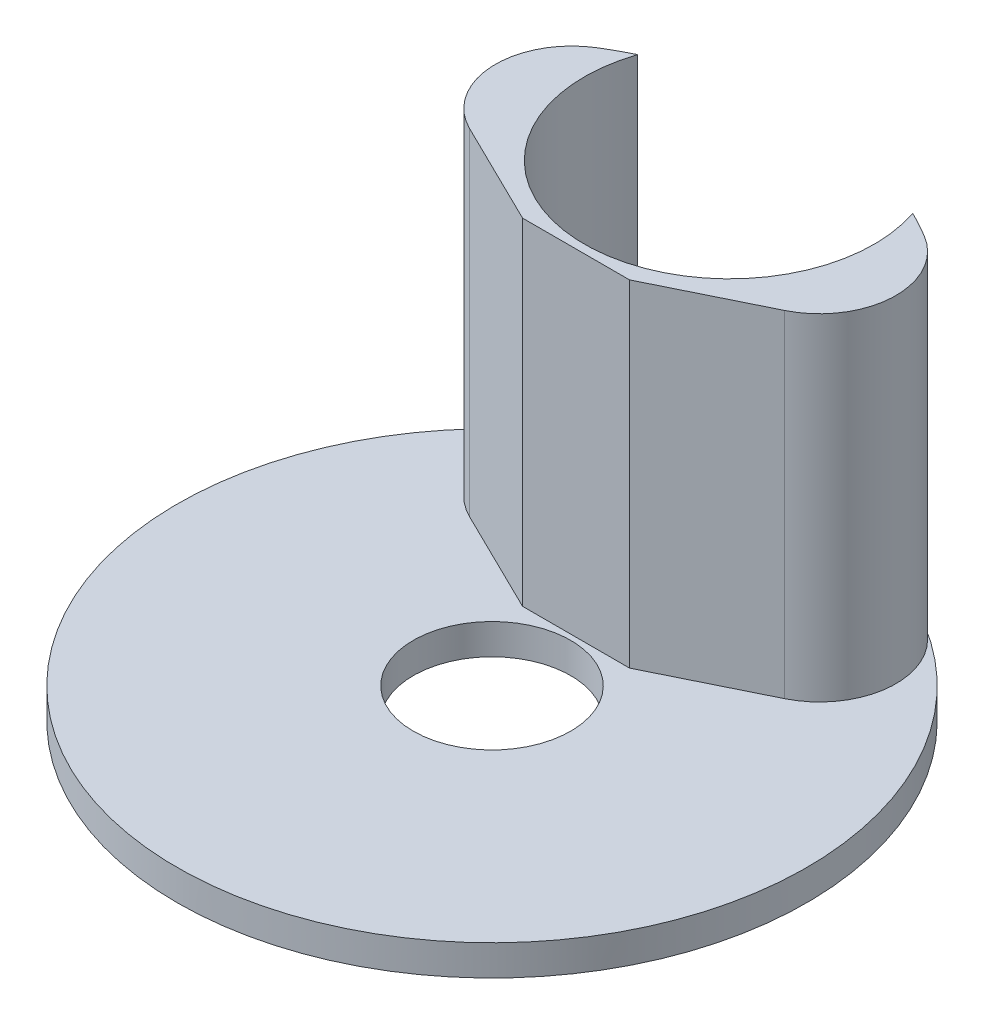
ISO-10303-21;
HEADER;
FILE_DESCRIPTION(('STEP AP214'),'2;1');
FILE_NAME('part.step','',(''),(''),'','','');
FILE_SCHEMA(('AUTOMOTIVE_DESIGN { 1 0 10303 214 1 1 1 1 }'));
ENDSEC;
DATA;
#1=APPLICATION_CONTEXT('core data for automotive mechanical design processes');
#2=APPLICATION_PROTOCOL_DEFINITION('international standard','automotive_design',2000,#1);
#3=PRODUCT_CONTEXT('',#1,'mechanical');
#4=PRODUCT('Part','Part','',(#3));
#5=PRODUCT_RELATED_PRODUCT_CATEGORY('part','',(#4));
#6=PRODUCT_DEFINITION_FORMATION('','',#4);
#7=PRODUCT_DEFINITION_CONTEXT('part definition',#1,'design');
#8=PRODUCT_DEFINITION('design','',#6,#7);
#9=PRODUCT_DEFINITION_SHAPE('','',#8);
#10=(LENGTH_UNIT() NAMED_UNIT(*) SI_UNIT(.MILLI.,.METRE.));
#11=(NAMED_UNIT(*) PLANE_ANGLE_UNIT() SI_UNIT($,.RADIAN.));
#12=(NAMED_UNIT(*) SI_UNIT($,.STERADIAN.) SOLID_ANGLE_UNIT());
#13=UNCERTAINTY_MEASURE_WITH_UNIT(LENGTH_MEASURE(1.E-05),#10,'distance_accuracy_value','');
#14=(GEOMETRIC_REPRESENTATION_CONTEXT(3) GLOBAL_UNCERTAINTY_ASSIGNED_CONTEXT((#13)) GLOBAL_UNIT_ASSIGNED_CONTEXT((#10,
#11,#12)) REPRESENTATION_CONTEXT('',''));
#15=CARTESIAN_POINT('',(0.,0.,0.));
#16=DIRECTION('',(0.,0.,1.));
#17=DIRECTION('',(1.,0.,0.));
#18=AXIS2_PLACEMENT_3D('',#15,#16,#17);
#19=CARTESIAN_POINT('',(0.,2.,0.));
#20=DIRECTION('',(0.,1.,0.));
#21=DIRECTION('',(0.,0.,1.));
#22=AXIS2_PLACEMENT_3D('',#19,#20,#21);
#23=PLANE('',#22);
#24=CARTESIAN_POINT('',(0.,2.,-13.));
#25=DIRECTION('',(0.,1.,0.));
#26=DIRECTION('',(0.,0.,1.));
#27=AXIS2_PLACEMENT_3D('',#24,#25,#26);
#28=CIRCLE('',#27,6.5);
#29=CARTESIAN_POINT('',(0.,2.,-6.5));
#30=VERTEX_POINT('',#29);
#31=EDGE_CURVE('E120',#30,#30,#28,.T.);
#32=ORIENTED_EDGE('',*,*,#31,.F.);
#33=EDGE_LOOP('',(#32));
#34=FACE_BOUND('',#33,.T.);
#35=CARTESIAN_POINT('',(0.,2.,0.));
#36=DIRECTION('',(0.,1.,0.));
#37=DIRECTION('',(0.,0.,1.));
#38=AXIS2_PLACEMENT_3D('',#35,#36,#37);
#39=CIRCLE('',#38,20.6);
#40=CARTESIAN_POINT('',(9.,2.,-18.5299757150408));
#41=VERTEX_POINT('',#40);
#42=CARTESIAN_POINT('',(-9.00000000000001,2.,-18.5299757150408));
#43=VERTEX_POINT('',#42);
#44=EDGE_CURVE('E183',#41,#43,#39,.T.);
#45=ORIENTED_EDGE('',*,*,#44,.T.);
#46=CARTESIAN_POINT('',(0.,2.,-15.5296842366197));
#47=DIRECTION('',(0.,1.,0.));
#48=DIRECTION('',(0.,0.,1.));
#49=AXIS2_PLACEMENT_3D('',#46,#47,#48);
#50=CIRCLE('',#49,9.48692515810502);
#51=EDGE_CURVE('E115',#43,#41,#50,.T.);
#52=ORIENTED_EDGE('',*,*,#51,.T.);
#53=EDGE_LOOP('',(#45,#52));
#54=FACE_BOUND('',#53,.T.);
#55=ADVANCED_FACE('F41',(#34,#54),#23,.T.);
#56=CARTESIAN_POINT('',(0.,2.,0.));
#57=DIRECTION('',(0.,-1.,0.));
#58=DIRECTION('',(0.,0.,-1.));
#59=AXIS2_PLACEMENT_3D('',#56,#57,#58);
#60=CYLINDRICAL_SURFACE('',#59,20.6);
#61=CARTESIAN_POINT('',(0.,24.,0.));
#62=DIRECTION('',(0.,1.,0.));
#63=DIRECTION('',(0.,0.,1.));
#64=AXIS2_PLACEMENT_3D('',#61,#62,#63);
#65=CIRCLE('',#64,20.6);
#66=CARTESIAN_POINT('',(10.7020794980103,24.,-17.6018605385416));
#67=VERTEX_POINT('',#66);
#68=CARTESIAN_POINT('',(9.,24.,-18.5299757150408));
#69=VERTEX_POINT('',#68);
#70=EDGE_CURVE('E131',#67,#69,#65,.T.);
#71=ORIENTED_EDGE('',*,*,#70,.F.);
#72=DIRECTION('',(0.,-1.,0.));
#73=VECTOR('',#72,1.);
#74=CARTESIAN_POINT('',(10.7020794980103,2.,-17.6018605385416));
#75=LINE('',#74,#73);
#76=CARTESIAN_POINT('',(10.7020794980103,2.,-17.6018605385416));
#77=VERTEX_POINT('',#76);
#78=EDGE_CURVE('E193',#67,#77,#75,.T.);
#79=ORIENTED_EDGE('',*,*,#78,.T.);
#80=CARTESIAN_POINT('',(-10.7020794980103,2.,-17.6018605385416));
#81=VERTEX_POINT('',#80);
#82=EDGE_CURVE('E180',#81,#77,#39,.T.);
#83=ORIENTED_EDGE('',*,*,#82,.F.);
#84=DIRECTION('',(0.,-1.,0.));
#85=VECTOR('',#84,1.);
#86=CARTESIAN_POINT('',(-10.7020794980103,2.,-17.6018605385416));
#87=LINE('',#86,#85);
#88=CARTESIAN_POINT('',(-10.7020794980103,24.,-17.6018605385416));
#89=VERTEX_POINT('',#88);
#90=EDGE_CURVE('E127',#81,#89,#87,.F.);
#91=ORIENTED_EDGE('',*,*,#90,.T.);
#92=CARTESIAN_POINT('',(-9.00000000000001,24.,-18.5299757150408));
#93=VERTEX_POINT('',#92);
#94=EDGE_CURVE('E123',#93,#89,#65,.T.);
#95=ORIENTED_EDGE('',*,*,#94,.F.);
#96=DIRECTION('',(0.,-1.,0.));
#97=VECTOR('',#96,1.);
#98=CARTESIAN_POINT('',(-9.00000000000001,24.,-18.5299757150408));
#99=LINE('',#98,#97);
#100=EDGE_CURVE('E109',#93,#43,#99,.T.);
#101=ORIENTED_EDGE('',*,*,#100,.T.);
#102=ORIENTED_EDGE('',*,*,#44,.F.);
#103=DIRECTION('',(0.,-1.,0.));
#104=VECTOR('',#103,1.);
#105=CARTESIAN_POINT('',(9.,24.,-18.5299757150408));
#106=LINE('',#105,#104);
#107=EDGE_CURVE('E159',#69,#41,#106,.T.);
#108=ORIENTED_EDGE('',*,*,#107,.F.);
#109=EDGE_LOOP('',(#71,#79,#83,#91,#95,#101,#102,#108));
#110=FACE_BOUND('',#109,.T.);
#111=CARTESIAN_POINT('',(0.,0.,0.));
#112=DIRECTION('',(0.,1.,0.));
#113=DIRECTION('',(0.,0.,1.));
#114=AXIS2_PLACEMENT_3D('',#111,#112,#113);
#115=CIRCLE('',#114,20.6);
#116=CARTESIAN_POINT('',(0.,0.,20.6));
#117=VERTEX_POINT('',#116);
#118=EDGE_CURVE('E184',#117,#117,#115,.T.);
#119=ORIENTED_EDGE('',*,*,#118,.T.);
#120=EDGE_LOOP('',(#119));
#121=FACE_BOUND('',#120,.T.);
#122=ADVANCED_FACE('F125',(#110,#121),#60,.T.);
#123=DIRECTION('',(0.897709903987118,0.,-0.440587026912322));
#124=VECTOR('',#123,1.);
#125=CARTESIAN_POINT('',(-1.49594710795883,2.,-3.04803921274508));
#126=LINE('',#125,#124);
#127=CARTESIAN_POINT('',(3.5,2.,-5.5));
#128=VERTEX_POINT('',#127);
#129=CARTESIAN_POINT('',(10.3074225214044,2.,-8.84101477138717));
#130=VERTEX_POINT('',#129);
#131=EDGE_CURVE('E136',#128,#130,#126,.T.);
#132=ORIENTED_EDGE('',*,*,#131,.F.);
#133=DIRECTION('',(1.,0.,0.));
#134=VECTOR('',#133,1.);
#135=CARTESIAN_POINT('',(0.,2.,-5.5));
#136=LINE('',#135,#134);
#137=CARTESIAN_POINT('',(-3.5,2.,-5.5));
#138=VERTEX_POINT('',#137);
#139=EDGE_CURVE('E140',#138,#128,#136,.T.);
#140=ORIENTED_EDGE('',*,*,#139,.F.);
#141=DIRECTION('',(-0.897709903987118,0.,-0.440587026912322));
#142=VECTOR('',#141,1.);
#143=CARTESIAN_POINT('',(1.49594710795883,2.,-3.04803921274508));
#144=LINE('',#143,#142);
#145=CARTESIAN_POINT('',(-10.3074225214044,2.,-8.84101477138717));
#146=VERTEX_POINT('',#145);
#147=EDGE_CURVE('E153',#138,#146,#144,.T.);
#148=ORIENTED_EDGE('',*,*,#147,.T.);
#149=CARTESIAN_POINT('',(-8.10448738684275,2.,-13.3295642913228));
#150=DIRECTION('',(0.,1.,0.));
#151=DIRECTION('',(0.,0.,1.));
#152=AXIS2_PLACEMENT_3D('',#149,#150,#151);
#153=CIRCLE('',#152,5.);
#154=EDGE_CURVE('E11',#146,#81,#153,.F.);
#155=ORIENTED_EDGE('',*,*,#154,.T.);
#156=ORIENTED_EDGE('',*,*,#82,.T.);
#157=CARTESIAN_POINT('',(8.10448738684275,2.,-13.3295642913228));
#158=DIRECTION('',(0.,1.,0.));
#159=DIRECTION('',(0.,0.,1.));
#160=AXIS2_PLACEMENT_3D('',#157,#158,#159);
#161=CIRCLE('',#160,5.);
#162=EDGE_CURVE('E50',#77,#130,#161,.F.);
#163=ORIENTED_EDGE('',*,*,#162,.T.);
#164=EDGE_LOOP('',(#132,#140,#148,#155,#156,#163));
#165=FACE_BOUND('',#164,.T.);
#166=CARTESIAN_POINT('',(0.,2.,0.));
#167=DIRECTION('',(0.,1.,0.));
#168=DIRECTION('',(0.,0.,1.));
#169=AXIS2_PLACEMENT_3D('',#166,#167,#168);
#170=CIRCLE('',#169,5.15);
#171=CARTESIAN_POINT('',(0.,2.,5.15));
#172=VERTEX_POINT('',#171);
#173=EDGE_CURVE('E172',#172,#172,#170,.T.);
#174=ORIENTED_EDGE('',*,*,#173,.F.);
#175=EDGE_LOOP('',(#174));
#176=FACE_BOUND('',#175,.T.);
#177=ADVANCED_FACE('F211',(#165,#176),#23,.T.);
#178=CARTESIAN_POINT('',(0.,0.,0.));
#179=DIRECTION('',(0.,1.,0.));
#180=DIRECTION('',(0.,0.,1.));
#181=AXIS2_PLACEMENT_3D('',#178,#179,#180);
#182=PLANE('',#181);
#183=CARTESIAN_POINT('',(0.,0.,-13.));
#184=DIRECTION('',(0.,1.,0.));
#185=DIRECTION('',(0.,0.,1.));
#186=AXIS2_PLACEMENT_3D('',#183,#184,#185);
#187=CIRCLE('',#186,6.5);
#188=CARTESIAN_POINT('',(0.,0.,-6.5));
#189=VERTEX_POINT('',#188);
#190=EDGE_CURVE('E168',#189,#189,#187,.T.);
#191=ORIENTED_EDGE('',*,*,#190,.T.);
#192=EDGE_LOOP('',(#191));
#193=FACE_BOUND('',#192,.T.);
#194=CARTESIAN_POINT('',(0.,0.,0.));
#195=DIRECTION('',(0.,1.,0.));
#196=DIRECTION('',(0.,0.,1.));
#197=AXIS2_PLACEMENT_3D('',#194,#195,#196);
#198=CIRCLE('',#197,5.15);
#199=CARTESIAN_POINT('',(0.,0.,5.15));
#200=VERTEX_POINT('',#199);
#201=EDGE_CURVE('E179',#200,#200,#198,.T.);
#202=ORIENTED_EDGE('',*,*,#201,.T.);
#203=EDGE_LOOP('',(#202));
#204=FACE_BOUND('',#203,.T.);
#205=ORIENTED_EDGE('',*,*,#118,.F.);
#206=EDGE_LOOP('',(#205));
#207=FACE_BOUND('',#206,.T.);
#208=ADVANCED_FACE('F237',(#193,#204,#207),#182,.F.);
#209=CARTESIAN_POINT('',(0.,-1.,0.));
#210=DIRECTION('',(0.,1.,0.));
#211=DIRECTION('',(0.,0.,1.));
#212=AXIS2_PLACEMENT_3D('',#209,#210,#211);
#213=CYLINDRICAL_SURFACE('',#212,5.15);
#214=ORIENTED_EDGE('',*,*,#173,.T.);
#215=EDGE_LOOP('',(#214));
#216=FACE_BOUND('',#215,.T.);
#217=ORIENTED_EDGE('',*,*,#201,.F.);
#218=EDGE_LOOP('',(#217));
#219=FACE_BOUND('',#218,.T.);
#220=ADVANCED_FACE('F241',(#216,#219),#213,.F.);
#221=CARTESIAN_POINT('',(0.,0.,-13.));
#222=DIRECTION('',(0.,1.,0.));
#223=DIRECTION('',(0.,0.,1.));
#224=AXIS2_PLACEMENT_3D('',#221,#222,#223);
#225=CYLINDRICAL_SURFACE('',#224,6.5);
#226=ORIENTED_EDGE('',*,*,#190,.F.);
#227=EDGE_LOOP('',(#226));
#228=FACE_BOUND('',#227,.T.);
#229=ORIENTED_EDGE('',*,*,#31,.T.);
#230=EDGE_LOOP('',(#229));
#231=FACE_BOUND('',#230,.T.);
#232=ADVANCED_FACE('F246',(#228,#231),#225,.F.);
#233=CARTESIAN_POINT('',(0.,24.,-15.5296842366197));
#234=DIRECTION('',(0.,-1.,0.));
#235=DIRECTION('',(0.,0.,-1.));
#236=AXIS2_PLACEMENT_3D('',#233,#234,#235);
#237=CYLINDRICAL_SURFACE('',#236,9.48692515810502);
#238=ORIENTED_EDGE('',*,*,#51,.F.);
#239=ORIENTED_EDGE('',*,*,#100,.F.);
#240=CARTESIAN_POINT('',(0.,24.,-15.5296842366197));
#241=DIRECTION('',(0.,1.,0.));
#242=DIRECTION('',(0.,0.,1.));
#243=AXIS2_PLACEMENT_3D('',#240,#241,#242);
#244=CIRCLE('',#243,9.48692515810502);
#245=EDGE_CURVE('E113',#93,#69,#244,.T.);
#246=ORIENTED_EDGE('',*,*,#245,.T.);
#247=ORIENTED_EDGE('',*,*,#107,.T.);
#248=EDGE_LOOP('',(#238,#239,#246,#247));
#249=FACE_BOUND('',#248,.T.);
#250=ADVANCED_FACE('F111',(#249),#237,.F.);
#251=CARTESIAN_POINT('',(1.49594710795883,24.,-3.04803921274508));
#252=DIRECTION('',(-0.440587026912321,0.,0.897709903987118));
#253=DIRECTION('',(0.897709903987118,0.,0.440587026912321));
#254=AXIS2_PLACEMENT_3D('',#251,#252,#253);
#255=PLANE('',#254);
#256=DIRECTION('',(-0.897709903987118,0.,-0.440587026912322));
#257=VECTOR('',#256,1.);
#258=CARTESIAN_POINT('',(1.49594710795883,24.,-3.04803921274508));
#259=LINE('',#258,#257);
#260=CARTESIAN_POINT('',(-3.5,24.,-5.5));
#261=VERTEX_POINT('',#260);
#262=CARTESIAN_POINT('',(-10.3074225214044,24.,-8.84101477138717));
#263=VERTEX_POINT('',#262);
#264=EDGE_CURVE('E129',#261,#263,#259,.T.);
#265=ORIENTED_EDGE('',*,*,#264,.T.);
#266=DIRECTION('',(0.,1.,0.));
#267=VECTOR('',#266,1.);
#268=CARTESIAN_POINT('',(-10.3074225214044,2.,-8.84101477138717));
#269=LINE('',#268,#267);
#270=EDGE_CURVE('E205',#263,#146,#269,.F.);
#271=ORIENTED_EDGE('',*,*,#270,.T.);
#272=ORIENTED_EDGE('',*,*,#147,.F.);
#273=DIRECTION('',(0.,-1.,0.));
#274=VECTOR('',#273,1.);
#275=CARTESIAN_POINT('',(-3.5,24.,-5.5));
#276=LINE('',#275,#274);
#277=EDGE_CURVE('E121',#261,#138,#276,.T.);
#278=ORIENTED_EDGE('',*,*,#277,.F.);
#279=EDGE_LOOP('',(#265,#271,#272,#278));
#280=FACE_BOUND('',#279,.T.);
#281=ADVANCED_FACE('F263',(#280),#255,.T.);
#282=CARTESIAN_POINT('',(0.,24.,-5.5));
#283=DIRECTION('',(0.,0.,-1.));
#284=DIRECTION('',(-1.,0.,0.));
#285=AXIS2_PLACEMENT_3D('',#282,#283,#284);
#286=PLANE('',#285);
#287=ORIENTED_EDGE('',*,*,#139,.T.);
#288=DIRECTION('',(0.,-1.,0.));
#289=VECTOR('',#288,1.);
#290=CARTESIAN_POINT('',(3.5,24.,-5.5));
#291=LINE('',#290,#289);
#292=CARTESIAN_POINT('',(3.5,24.,-5.5));
#293=VERTEX_POINT('',#292);
#294=EDGE_CURVE('E162',#293,#128,#291,.T.);
#295=ORIENTED_EDGE('',*,*,#294,.F.);
#296=DIRECTION('',(1.,0.,0.));
#297=VECTOR('',#296,1.);
#298=CARTESIAN_POINT('',(0.,24.,-5.5));
#299=LINE('',#298,#297);
#300=EDGE_CURVE('E145',#261,#293,#299,.T.);
#301=ORIENTED_EDGE('',*,*,#300,.F.);
#302=ORIENTED_EDGE('',*,*,#277,.T.);
#303=EDGE_LOOP('',(#287,#295,#301,#302));
#304=FACE_BOUND('',#303,.T.);
#305=ADVANCED_FACE('F258',(#304),#286,.F.);
#306=CARTESIAN_POINT('',(-1.49594710795883,24.,-3.04803921274508));
#307=DIRECTION('',(-0.440587026912321,0.,-0.897709903987118));
#308=DIRECTION('',(-0.897709903987118,0.,0.440587026912321));
#309=AXIS2_PLACEMENT_3D('',#306,#307,#308);
#310=PLANE('',#309);
#311=ORIENTED_EDGE('',*,*,#131,.T.);
#312=DIRECTION('',(0.,-1.,0.));
#313=VECTOR('',#312,1.);
#314=CARTESIAN_POINT('',(10.3074225214044,24.,-8.84101477138717));
#315=LINE('',#314,#313);
#316=CARTESIAN_POINT('',(10.3074225214044,24.,-8.84101477138717));
#317=VERTEX_POINT('',#316);
#318=EDGE_CURVE('E197',#130,#317,#315,.F.);
#319=ORIENTED_EDGE('',*,*,#318,.T.);
#320=DIRECTION('',(0.897709903987118,0.,-0.440587026912322));
#321=VECTOR('',#320,1.);
#322=CARTESIAN_POINT('',(-1.49594710795883,24.,-3.04803921274508));
#323=LINE('',#322,#321);
#324=EDGE_CURVE('E148',#293,#317,#323,.T.);
#325=ORIENTED_EDGE('',*,*,#324,.F.);
#326=ORIENTED_EDGE('',*,*,#294,.T.);
#327=EDGE_LOOP('',(#311,#319,#325,#326));
#328=FACE_BOUND('',#327,.T.);
#329=ADVANCED_FACE('F218',(#328),#310,.F.);
#330=CARTESIAN_POINT('',(0.,24.,0.));
#331=DIRECTION('',(0.,1.,0.));
#332=DIRECTION('',(0.,0.,1.));
#333=AXIS2_PLACEMENT_3D('',#330,#331,#332);
#334=PLANE('',#333);
#335=ORIENTED_EDGE('',*,*,#324,.T.);
#336=CARTESIAN_POINT('',(8.10448738684275,24.,-13.3295642913228));
#337=DIRECTION('',(0.,1.,0.));
#338=DIRECTION('',(0.,0.,1.));
#339=AXIS2_PLACEMENT_3D('',#336,#337,#338);
#340=CIRCLE('',#339,5.);
#341=EDGE_CURVE('E202',#317,#67,#340,.T.);
#342=ORIENTED_EDGE('',*,*,#341,.T.);
#343=ORIENTED_EDGE('',*,*,#70,.T.);
#344=ORIENTED_EDGE('',*,*,#245,.F.);
#345=ORIENTED_EDGE('',*,*,#94,.T.);
#346=CARTESIAN_POINT('',(-8.10448738684275,24.,-13.3295642913228));
#347=DIRECTION('',(0.,1.,0.));
#348=DIRECTION('',(0.,0.,1.));
#349=AXIS2_PLACEMENT_3D('',#346,#347,#348);
#350=CIRCLE('',#349,5.);
#351=EDGE_CURVE('E63',#89,#263,#350,.T.);
#352=ORIENTED_EDGE('',*,*,#351,.T.);
#353=ORIENTED_EDGE('',*,*,#264,.F.);
#354=ORIENTED_EDGE('',*,*,#300,.T.);
#355=EDGE_LOOP('',(#335,#342,#343,#344,#345,#352,#353,#354));
#356=FACE_BOUND('',#355,.T.);
#357=ADVANCED_FACE('F133',(#356),#334,.T.);
#358=CARTESIAN_POINT('',(8.10448738684275,2.,-13.3295642913228));
#359=DIRECTION('',(0.,-1.,0.));
#360=DIRECTION('',(0.,0.,-1.));
#361=AXIS2_PLACEMENT_3D('',#358,#359,#360);
#362=CYLINDRICAL_SURFACE('',#361,5.);
#363=ORIENTED_EDGE('',*,*,#341,.F.);
#364=ORIENTED_EDGE('',*,*,#318,.F.);
#365=ORIENTED_EDGE('',*,*,#162,.F.);
#366=ORIENTED_EDGE('',*,*,#78,.F.);
#367=EDGE_LOOP('',(#363,#364,#365,#366));
#368=FACE_BOUND('',#367,.T.);
#369=ADVANCED_FACE('F222',(#368),#362,.T.);
#370=CARTESIAN_POINT('',(-8.10448738684275,2.,-13.3295642913228));
#371=DIRECTION('',(0.,-1.,0.));
#372=DIRECTION('',(0.,0.,-1.));
#373=AXIS2_PLACEMENT_3D('',#370,#371,#372);
#374=CYLINDRICAL_SURFACE('',#373,5.);
#375=ORIENTED_EDGE('',*,*,#351,.F.);
#376=ORIENTED_EDGE('',*,*,#90,.F.);
#377=ORIENTED_EDGE('',*,*,#154,.F.);
#378=ORIENTED_EDGE('',*,*,#270,.F.);
#379=EDGE_LOOP('',(#375,#376,#377,#378));
#380=FACE_BOUND('',#379,.T.);
#381=ADVANCED_FACE('F43',(#380),#374,.T.);
#382=CLOSED_SHELL('',(#55,#122,#177,#208,#220,#232,#250,#281,#305,#329,#357,#369,#381));
#383=MANIFOLD_SOLID_BREP('B2',#382);
#384=ADVANCED_BREP_SHAPE_REPRESENTATION('',(#18,#383),#14);
#385=SHAPE_DEFINITION_REPRESENTATION(#9,#384);
ENDSEC;
END-ISO-10303-21;
